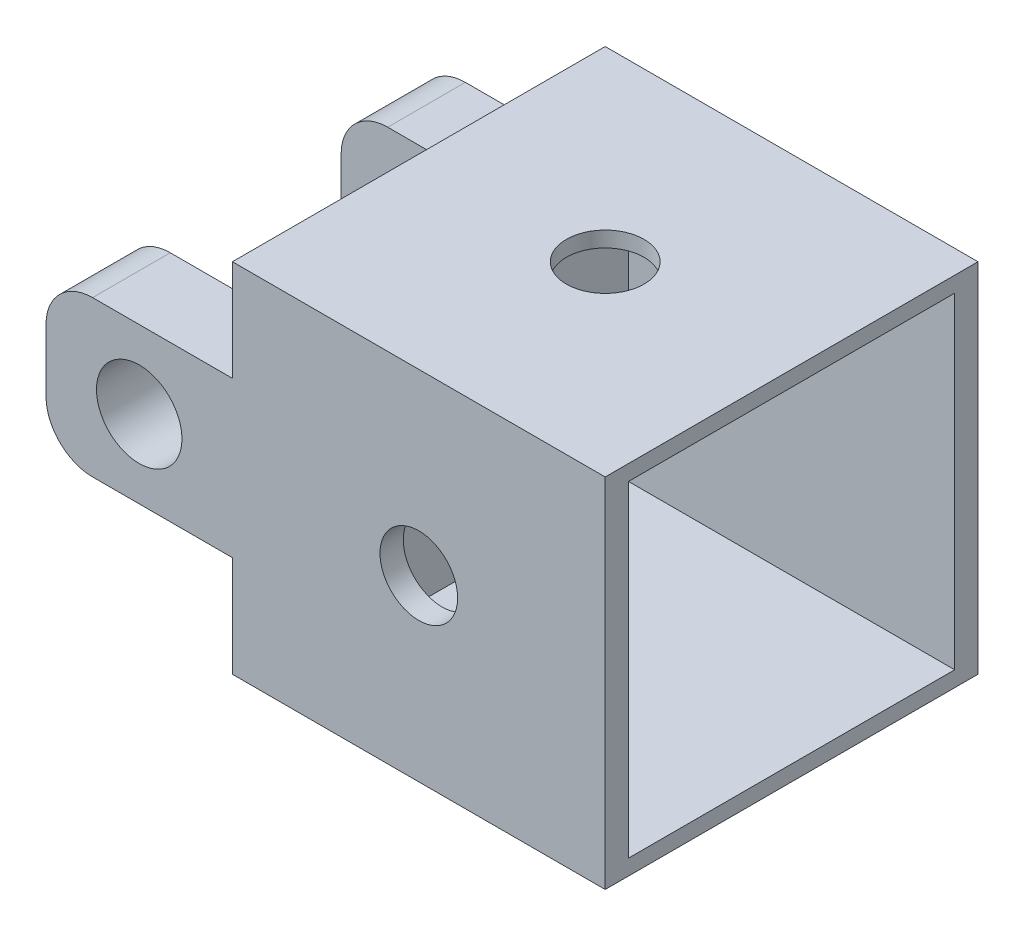
ISO-10303-21;
HEADER;
FILE_DESCRIPTION(('STEP AP214'),'2;1');
FILE_NAME('part.step','',(''),(''),'','','');
FILE_SCHEMA(('AUTOMOTIVE_DESIGN { 1 0 10303 214 1 1 1 1 }'));
ENDSEC;
DATA;
#1=APPLICATION_CONTEXT('core data for automotive mechanical design processes');
#2=APPLICATION_PROTOCOL_DEFINITION('international standard','automotive_design',2000,#1);
#3=PRODUCT_CONTEXT('',#1,'mechanical');
#4=PRODUCT('Part','Part','',(#3));
#5=PRODUCT_RELATED_PRODUCT_CATEGORY('part','',(#4));
#6=PRODUCT_DEFINITION_FORMATION('','',#4);
#7=PRODUCT_DEFINITION_CONTEXT('part definition',#1,'design');
#8=PRODUCT_DEFINITION('design','',#6,#7);
#9=PRODUCT_DEFINITION_SHAPE('','',#8);
#10=(LENGTH_UNIT() NAMED_UNIT(*) SI_UNIT(.MILLI.,.METRE.));
#11=(NAMED_UNIT(*) PLANE_ANGLE_UNIT() SI_UNIT($,.RADIAN.));
#12=(NAMED_UNIT(*) SI_UNIT($,.STERADIAN.) SOLID_ANGLE_UNIT());
#13=UNCERTAINTY_MEASURE_WITH_UNIT(LENGTH_MEASURE(1.E-05),#10,'distance_accuracy_value','');
#14=(GEOMETRIC_REPRESENTATION_CONTEXT(3) GLOBAL_UNCERTAINTY_ASSIGNED_CONTEXT((#13)) GLOBAL_UNIT_ASSIGNED_CONTEXT((#10,
#11,#12)) REPRESENTATION_CONTEXT('',''));
#15=CARTESIAN_POINT('',(0.,0.,0.));
#16=DIRECTION('',(0.,0.,1.));
#17=DIRECTION('',(1.,0.,0.));
#18=AXIS2_PLACEMENT_3D('',#15,#16,#17);
#19=CARTESIAN_POINT('',(-12.,11.5,12.));
#20=DIRECTION('',(1.,0.,0.));
#21=DIRECTION('',(0.,0.,-1.));
#22=AXIS2_PLACEMENT_3D('',#19,#20,#21);
#23=PLANE('',#22);
#24=DIRECTION('',(0.,-1.,0.));
#25=VECTOR('',#24,1.);
#26=CARTESIAN_POINT('',(-12.,11.5,12.));
#27=LINE('',#26,#25);
#28=CARTESIAN_POINT('',(-12.,-5.,12.));
#29=VERTEX_POINT('',#28);
#30=CARTESIAN_POINT('',(-12.,-11.5,12.));
#31=VERTEX_POINT('',#30);
#32=EDGE_CURVE('E211',#29,#31,#27,.T.);
#33=ORIENTED_EDGE('',*,*,#32,.F.);
#34=DIRECTION('',(0.,0.,-1.));
#35=VECTOR('',#34,1.);
#36=CARTESIAN_POINT('',(-12.,-5.,12.));
#37=LINE('',#36,#35);
#38=CARTESIAN_POINT('',(-12.,-5.,7.));
#39=VERTEX_POINT('',#38);
#40=EDGE_CURVE('E189',#29,#39,#37,.T.);
#41=ORIENTED_EDGE('',*,*,#40,.T.);
#42=DIRECTION('',(0.,1.,0.));
#43=VECTOR('',#42,1.);
#44=CARTESIAN_POINT('',(-12.,0.,7.));
#45=LINE('',#44,#43);
#46=CARTESIAN_POINT('',(-12.,5.,7.));
#47=VERTEX_POINT('',#46);
#48=EDGE_CURVE('E199',#39,#47,#45,.T.);
#49=ORIENTED_EDGE('',*,*,#48,.T.);
#50=DIRECTION('',(0.,0.,1.));
#51=VECTOR('',#50,1.);
#52=CARTESIAN_POINT('',(-12.,5.,7.));
#53=LINE('',#52,#51);
#54=CARTESIAN_POINT('',(-12.,5.,12.));
#55=VERTEX_POINT('',#54);
#56=EDGE_CURVE('E208',#47,#55,#53,.T.);
#57=ORIENTED_EDGE('',*,*,#56,.T.);
#58=CARTESIAN_POINT('',(-12.,11.5,12.));
#59=VERTEX_POINT('',#58);
#60=EDGE_CURVE('E356',#59,#55,#27,.T.);
#61=ORIENTED_EDGE('',*,*,#60,.F.);
#62=DIRECTION('',(0.,0.,1.));
#63=VECTOR('',#62,1.);
#64=CARTESIAN_POINT('',(-12.,11.5,12.));
#65=LINE('',#64,#63);
#66=CARTESIAN_POINT('',(-12.,11.5,-12.));
#67=VERTEX_POINT('',#66);
#68=EDGE_CURVE('E334',#67,#59,#65,.T.);
#69=ORIENTED_EDGE('',*,*,#68,.F.);
#70=DIRECTION('',(0.,-1.,0.));
#71=VECTOR('',#70,1.);
#72=CARTESIAN_POINT('',(-12.,11.5,-12.));
#73=LINE('',#72,#71);
#74=CARTESIAN_POINT('',(-12.,5.,-12.));
#75=VERTEX_POINT('',#74);
#76=EDGE_CURVE('E361',#67,#75,#73,.T.);
#77=ORIENTED_EDGE('',*,*,#76,.T.);
#78=DIRECTION('',(0.,0.,-1.));
#79=VECTOR('',#78,1.);
#80=CARTESIAN_POINT('',(-12.,5.,-7.));
#81=LINE('',#80,#79);
#82=CARTESIAN_POINT('',(-12.,5.,-7.));
#83=VERTEX_POINT('',#82);
#84=EDGE_CURVE('E253',#83,#75,#81,.T.);
#85=ORIENTED_EDGE('',*,*,#84,.F.);
#86=DIRECTION('',(0.,1.,0.));
#87=VECTOR('',#86,1.);
#88=CARTESIAN_POINT('',(-12.,0.,-7.));
#89=LINE('',#88,#87);
#90=CARTESIAN_POINT('',(-12.,-5.,-7.));
#91=VERTEX_POINT('',#90);
#92=EDGE_CURVE('E236',#91,#83,#89,.T.);
#93=ORIENTED_EDGE('',*,*,#92,.F.);
#94=DIRECTION('',(0.,0.,1.));
#95=VECTOR('',#94,1.);
#96=CARTESIAN_POINT('',(-12.,-5.,-12.));
#97=LINE('',#96,#95);
#98=CARTESIAN_POINT('',(-12.,-5.,-12.));
#99=VERTEX_POINT('',#98);
#100=EDGE_CURVE('E245',#99,#91,#97,.T.);
#101=ORIENTED_EDGE('',*,*,#100,.F.);
#102=CARTESIAN_POINT('',(-12.,-11.5,-12.));
#103=VERTEX_POINT('',#102);
#104=EDGE_CURVE('E360',#99,#103,#73,.T.);
#105=ORIENTED_EDGE('',*,*,#104,.T.);
#106=DIRECTION('',(0.,0.,1.));
#107=VECTOR('',#106,1.);
#108=CARTESIAN_POINT('',(-12.,-11.5,12.));
#109=LINE('',#108,#107);
#110=EDGE_CURVE('E348',#103,#31,#109,.T.);
#111=ORIENTED_EDGE('',*,*,#110,.T.);
#112=EDGE_LOOP('',(#33,#41,#49,#57,#61,#69,#77,#85,#93,#101,#105,#111));
#113=FACE_BOUND('',#112,.T.);
#114=ADVANCED_FACE('F43',(#113),#23,.F.);
#115=CARTESIAN_POINT('',(12.,11.5,12.));
#116=DIRECTION('',(-1.,0.,0.));
#117=DIRECTION('',(0.,0.,1.));
#118=AXIS2_PLACEMENT_3D('',#115,#116,#117);
#119=PLANE('',#118);
#120=DIRECTION('',(0.,0.,1.));
#121=VECTOR('',#120,1.);
#122=CARTESIAN_POINT('',(12.,10.5,10.5));
#123=LINE('',#122,#121);
#124=CARTESIAN_POINT('',(12.,10.5,-10.5));
#125=VERTEX_POINT('',#124);
#126=CARTESIAN_POINT('',(12.,10.5,10.5));
#127=VERTEX_POINT('',#126);
#128=EDGE_CURVE('E302',#125,#127,#123,.T.);
#129=ORIENTED_EDGE('',*,*,#128,.F.);
#130=DIRECTION('',(0.,1.,0.));
#131=VECTOR('',#130,1.);
#132=CARTESIAN_POINT('',(12.,-10.5,-10.5));
#133=LINE('',#132,#131);
#134=CARTESIAN_POINT('',(12.,-10.5,-10.5));
#135=VERTEX_POINT('',#134);
#136=EDGE_CURVE('E299',#135,#125,#133,.T.);
#137=ORIENTED_EDGE('',*,*,#136,.F.);
#138=DIRECTION('',(0.,0.,-1.));
#139=VECTOR('',#138,1.);
#140=CARTESIAN_POINT('',(12.,-10.5,10.5));
#141=LINE('',#140,#139);
#142=CARTESIAN_POINT('',(12.,-10.5,10.5));
#143=VERTEX_POINT('',#142);
#144=EDGE_CURVE('E286',#143,#135,#141,.T.);
#145=ORIENTED_EDGE('',*,*,#144,.F.);
#146=DIRECTION('',(0.,-1.,0.));
#147=VECTOR('',#146,1.);
#148=CARTESIAN_POINT('',(12.,-10.5,10.5));
#149=LINE('',#148,#147);
#150=EDGE_CURVE('E306',#127,#143,#149,.T.);
#151=ORIENTED_EDGE('',*,*,#150,.F.);
#152=EDGE_LOOP('',(#129,#137,#145,#151));
#153=FACE_BOUND('',#152,.T.);
#154=DIRECTION('',(0.,0.,-1.));
#155=VECTOR('',#154,1.);
#156=CARTESIAN_POINT('',(12.,-11.5,12.));
#157=LINE('',#156,#155);
#158=CARTESIAN_POINT('',(12.,-11.5,12.));
#159=VERTEX_POINT('',#158);
#160=CARTESIAN_POINT('',(12.,-11.5,-12.));
#161=VERTEX_POINT('',#160);
#162=EDGE_CURVE('E316',#159,#161,#157,.T.);
#163=ORIENTED_EDGE('',*,*,#162,.T.);
#164=DIRECTION('',(0.,-1.,0.));
#165=VECTOR('',#164,1.);
#166=CARTESIAN_POINT('',(12.,11.5,-12.));
#167=LINE('',#166,#165);
#168=CARTESIAN_POINT('',(12.,11.5,-12.));
#169=VERTEX_POINT('',#168);
#170=EDGE_CURVE('E365',#169,#161,#167,.T.);
#171=ORIENTED_EDGE('',*,*,#170,.F.);
#172=DIRECTION('',(0.,0.,-1.));
#173=VECTOR('',#172,1.);
#174=CARTESIAN_POINT('',(12.,11.5,12.));
#175=LINE('',#174,#173);
#176=CARTESIAN_POINT('',(12.,11.5,12.));
#177=VERTEX_POINT('',#176);
#178=EDGE_CURVE('E326',#177,#169,#175,.T.);
#179=ORIENTED_EDGE('',*,*,#178,.F.);
#180=DIRECTION('',(0.,-1.,0.));
#181=VECTOR('',#180,1.);
#182=CARTESIAN_POINT('',(12.,11.5,12.));
#183=LINE('',#182,#181);
#184=EDGE_CURVE('E340',#177,#159,#183,.T.);
#185=ORIENTED_EDGE('',*,*,#184,.T.);
#186=EDGE_LOOP('',(#163,#171,#179,#185));
#187=FACE_BOUND('',#186,.T.);
#188=ADVANCED_FACE('F443',(#153,#187),#119,.F.);
#189=CARTESIAN_POINT('',(-12.,11.5,-12.));
#190=DIRECTION('',(0.,0.,1.));
#191=DIRECTION('',(1.,0.,0.));
#192=AXIS2_PLACEMENT_3D('',#189,#190,#191);
#193=PLANE('',#192);
#194=CARTESIAN_POINT('',(-18.,0.,-12.));
#195=DIRECTION('',(0.,0.,-1.));
#196=DIRECTION('',(-1.,0.,0.));
#197=AXIS2_PLACEMENT_3D('',#194,#195,#196);
#198=CIRCLE('',#197,2.75);
#199=CARTESIAN_POINT('',(-20.75,0.,-12.));
#200=VERTEX_POINT('',#199);
#201=EDGE_CURVE('E195',#200,#200,#198,.T.);
#202=ORIENTED_EDGE('',*,*,#201,.F.);
#203=EDGE_LOOP('',(#202));
#204=FACE_BOUND('',#203,.T.);
#205=DIRECTION('',(1.,0.,0.));
#206=VECTOR('',#205,1.);
#207=CARTESIAN_POINT('',(-24.,-5.,-12.));
#208=LINE('',#207,#206);
#209=CARTESIAN_POINT('',(-21.,-5.,-12.));
#210=VERTEX_POINT('',#209);
#211=EDGE_CURVE('E262',#210,#99,#208,.T.);
#212=ORIENTED_EDGE('',*,*,#211,.F.);
#213=CARTESIAN_POINT('',(-21.,-2.,-12.));
#214=DIRECTION('',(0.,0.,1.));
#215=DIRECTION('',(1.,0.,0.));
#216=AXIS2_PLACEMENT_3D('',#213,#214,#215);
#217=CIRCLE('',#216,3.);
#218=CARTESIAN_POINT('',(-24.,-2.,-12.));
#219=VERTEX_POINT('',#218);
#220=EDGE_CURVE('E395',#210,#219,#217,.F.);
#221=ORIENTED_EDGE('',*,*,#220,.T.);
#222=DIRECTION('',(0.,-1.,0.));
#223=VECTOR('',#222,1.);
#224=CARTESIAN_POINT('',(-24.,5.,-12.));
#225=LINE('',#224,#223);
#226=CARTESIAN_POINT('',(-24.,2.,-12.));
#227=VERTEX_POINT('',#226);
#228=EDGE_CURVE('E244',#227,#219,#225,.T.);
#229=ORIENTED_EDGE('',*,*,#228,.F.);
#230=CARTESIAN_POINT('',(-21.,2.,-12.));
#231=DIRECTION('',(0.,0.,1.));
#232=DIRECTION('',(1.,0.,0.));
#233=AXIS2_PLACEMENT_3D('',#230,#231,#232);
#234=CIRCLE('',#233,3.);
#235=CARTESIAN_POINT('',(-21.,5.,-12.));
#236=VERTEX_POINT('',#235);
#237=EDGE_CURVE('E392',#227,#236,#234,.F.);
#238=ORIENTED_EDGE('',*,*,#237,.T.);
#239=DIRECTION('',(1.,0.,0.));
#240=VECTOR('',#239,1.);
#241=CARTESIAN_POINT('',(-24.,5.,-12.));
#242=LINE('',#241,#240);
#243=EDGE_CURVE('E265',#236,#75,#242,.T.);
#244=ORIENTED_EDGE('',*,*,#243,.T.);
#245=ORIENTED_EDGE('',*,*,#76,.F.);
#246=DIRECTION('',(-1.,0.,0.));
#247=VECTOR('',#246,1.);
#248=CARTESIAN_POINT('',(-12.,11.5,-12.));
#249=LINE('',#248,#247);
#250=EDGE_CURVE('E330',#169,#67,#249,.T.);
#251=ORIENTED_EDGE('',*,*,#250,.F.);
#252=ORIENTED_EDGE('',*,*,#170,.T.);
#253=DIRECTION('',(-1.,0.,0.));
#254=VECTOR('',#253,1.);
#255=CARTESIAN_POINT('',(-12.,-11.5,-12.));
#256=LINE('',#255,#254);
#257=EDGE_CURVE('E344',#161,#103,#256,.T.);
#258=ORIENTED_EDGE('',*,*,#257,.T.);
#259=ORIENTED_EDGE('',*,*,#104,.F.);
#260=EDGE_LOOP('',(#212,#221,#229,#238,#244,#245,#251,#252,#258,#259));
#261=FACE_BOUND('',#260,.T.);
#262=ADVANCED_FACE('F448',(#204,#261),#193,.F.);
#263=CARTESIAN_POINT('',(-12.,11.5,12.));
#264=DIRECTION('',(0.,0.,-1.));
#265=DIRECTION('',(-1.,0.,0.));
#266=AXIS2_PLACEMENT_3D('',#263,#264,#265);
#267=PLANE('',#266);
#268=CARTESIAN_POINT('',(-18.,0.,12.));
#269=DIRECTION('',(0.,0.,-1.));
#270=DIRECTION('',(-1.,0.,0.));
#271=AXIS2_PLACEMENT_3D('',#268,#269,#270);
#272=CIRCLE('',#271,2.75);
#273=CARTESIAN_POINT('',(-20.75,0.,12.));
#274=VERTEX_POINT('',#273);
#275=EDGE_CURVE('E219',#274,#274,#272,.T.);
#276=ORIENTED_EDGE('',*,*,#275,.T.);
#277=EDGE_LOOP('',(#276));
#278=FACE_BOUND('',#277,.T.);
#279=CARTESIAN_POINT('',(0.,0.,12.));
#280=DIRECTION('',(0.,0.,1.));
#281=DIRECTION('',(1.,0.,0.));
#282=AXIS2_PLACEMENT_3D('',#279,#280,#281);
#283=CIRCLE('',#282,2.5);
#284=CARTESIAN_POINT('',(2.5,0.,12.));
#285=VERTEX_POINT('',#284);
#286=EDGE_CURVE('E271',#285,#285,#283,.T.);
#287=ORIENTED_EDGE('',*,*,#286,.F.);
#288=EDGE_LOOP('',(#287));
#289=FACE_BOUND('',#288,.T.);
#290=DIRECTION('',(0.,-1.,0.));
#291=VECTOR('',#290,1.);
#292=CARTESIAN_POINT('',(-24.,0.,12.));
#293=LINE('',#292,#291);
#294=CARTESIAN_POINT('',(-24.,2.,12.));
#295=VERTEX_POINT('',#294);
#296=CARTESIAN_POINT('',(-24.,-2.,12.));
#297=VERTEX_POINT('',#296);
#298=EDGE_CURVE('E222',#295,#297,#293,.T.);
#299=ORIENTED_EDGE('',*,*,#298,.T.);
#300=CARTESIAN_POINT('',(-21.,-2.,12.));
#301=DIRECTION('',(0.,0.,-1.));
#302=DIRECTION('',(-1.,0.,0.));
#303=AXIS2_PLACEMENT_3D('',#300,#301,#302);
#304=CIRCLE('',#303,3.);
#305=CARTESIAN_POINT('',(-21.,-5.,12.));
#306=VERTEX_POINT('',#305);
#307=EDGE_CURVE('E52',#297,#306,#304,.F.);
#308=ORIENTED_EDGE('',*,*,#307,.T.);
#309=DIRECTION('',(1.,0.,0.));
#310=VECTOR('',#309,1.);
#311=CARTESIAN_POINT('',(-24.,-5.,12.));
#312=LINE('',#311,#310);
#313=EDGE_CURVE('E196',#306,#29,#312,.T.);
#314=ORIENTED_EDGE('',*,*,#313,.T.);
#315=ORIENTED_EDGE('',*,*,#32,.T.);
#316=DIRECTION('',(1.,0.,0.));
#317=VECTOR('',#316,1.);
#318=CARTESIAN_POINT('',(-12.,-11.5,12.));
#319=LINE('',#318,#317);
#320=EDGE_CURVE('E331',#31,#159,#319,.T.);
#321=ORIENTED_EDGE('',*,*,#320,.T.);
#322=ORIENTED_EDGE('',*,*,#184,.F.);
#323=DIRECTION('',(1.,0.,0.));
#324=VECTOR('',#323,1.);
#325=CARTESIAN_POINT('',(-12.,11.5,12.));
#326=LINE('',#325,#324);
#327=EDGE_CURVE('E337',#59,#177,#326,.T.);
#328=ORIENTED_EDGE('',*,*,#327,.F.);
#329=ORIENTED_EDGE('',*,*,#60,.T.);
#330=DIRECTION('',(1.,0.,0.));
#331=VECTOR('',#330,1.);
#332=CARTESIAN_POINT('',(-24.,5.,12.));
#333=LINE('',#332,#331);
#334=CARTESIAN_POINT('',(-21.,5.,12.));
#335=VERTEX_POINT('',#334);
#336=EDGE_CURVE('E227',#335,#55,#333,.T.);
#337=ORIENTED_EDGE('',*,*,#336,.F.);
#338=CARTESIAN_POINT('',(-21.,2.,12.));
#339=DIRECTION('',(0.,0.,-1.));
#340=DIRECTION('',(-1.,0.,0.));
#341=AXIS2_PLACEMENT_3D('',#338,#339,#340);
#342=CIRCLE('',#341,3.);
#343=EDGE_CURVE('E59',#335,#295,#342,.F.);
#344=ORIENTED_EDGE('',*,*,#343,.T.);
#345=EDGE_LOOP('',(#299,#308,#314,#315,#321,#322,#328,#329,#337,#344));
#346=FACE_BOUND('',#345,.T.);
#347=ADVANCED_FACE('F418',(#278,#289,#346),#267,.F.);
#348=CARTESIAN_POINT('',(0.,11.5,0.));
#349=DIRECTION('',(0.,-1.,0.));
#350=DIRECTION('',(0.,0.,-1.));
#351=AXIS2_PLACEMENT_3D('',#348,#349,#350);
#352=PLANE('',#351);
#353=CARTESIAN_POINT('',(0.,11.5,0.));
#354=DIRECTION('',(0.,1.,0.));
#355=DIRECTION('',(0.,0.,1.));
#356=AXIS2_PLACEMENT_3D('',#353,#354,#355);
#357=CIRCLE('',#356,2.5);
#358=CARTESIAN_POINT('',(0.,11.5,2.5));
#359=VERTEX_POINT('',#358);
#360=EDGE_CURVE('E276',#359,#359,#357,.T.);
#361=ORIENTED_EDGE('',*,*,#360,.F.);
#362=EDGE_LOOP('',(#361));
#363=FACE_BOUND('',#362,.T.);
#364=ORIENTED_EDGE('',*,*,#178,.T.);
#365=ORIENTED_EDGE('',*,*,#250,.T.);
#366=ORIENTED_EDGE('',*,*,#68,.T.);
#367=ORIENTED_EDGE('',*,*,#327,.T.);
#368=EDGE_LOOP('',(#364,#365,#366,#367));
#369=FACE_BOUND('',#368,.T.);
#370=ADVANCED_FACE('F507',(#363,#369),#352,.F.);
#371=CARTESIAN_POINT('',(0.,-11.5,0.));
#372=DIRECTION('',(0.,-1.,0.));
#373=DIRECTION('',(0.,0.,-1.));
#374=AXIS2_PLACEMENT_3D('',#371,#372,#373);
#375=PLANE('',#374);
#376=ORIENTED_EDGE('',*,*,#162,.F.);
#377=ORIENTED_EDGE('',*,*,#320,.F.);
#378=ORIENTED_EDGE('',*,*,#110,.F.);
#379=ORIENTED_EDGE('',*,*,#257,.F.);
#380=EDGE_LOOP('',(#376,#377,#378,#379));
#381=FACE_BOUND('',#380,.T.);
#382=ADVANCED_FACE('F499',(#381),#375,.T.);
#383=CARTESIAN_POINT('',(-9.,-10.5,-10.5));
#384=DIRECTION('',(0.,0.,-1.));
#385=DIRECTION('',(-1.,0.,0.));
#386=AXIS2_PLACEMENT_3D('',#383,#384,#385);
#387=PLANE('',#386);
#388=ORIENTED_EDGE('',*,*,#136,.T.);
#389=DIRECTION('',(1.,0.,0.));
#390=VECTOR('',#389,1.);
#391=CARTESIAN_POINT('',(-9.,10.5,-10.5));
#392=LINE('',#391,#390);
#393=CARTESIAN_POINT('',(-9.,10.5,-10.5));
#394=VERTEX_POINT('',#393);
#395=EDGE_CURVE('E298',#394,#125,#392,.T.);
#396=ORIENTED_EDGE('',*,*,#395,.F.);
#397=DIRECTION('',(0.,1.,0.));
#398=VECTOR('',#397,1.);
#399=CARTESIAN_POINT('',(-9.,-10.5,-10.5));
#400=LINE('',#399,#398);
#401=CARTESIAN_POINT('',(-9.,-10.5,-10.5));
#402=VERTEX_POINT('',#401);
#403=EDGE_CURVE('E281',#402,#394,#400,.T.);
#404=ORIENTED_EDGE('',*,*,#403,.F.);
#405=DIRECTION('',(1.,0.,0.));
#406=VECTOR('',#405,1.);
#407=CARTESIAN_POINT('',(-9.,-10.5,-10.5));
#408=LINE('',#407,#406);
#409=EDGE_CURVE('E313',#402,#135,#408,.T.);
#410=ORIENTED_EDGE('',*,*,#409,.T.);
#411=EDGE_LOOP('',(#388,#396,#404,#410));
#412=FACE_BOUND('',#411,.T.);
#413=ADVANCED_FACE('F716',(#412),#387,.F.);
#414=CARTESIAN_POINT('',(-9.,-10.5,10.5));
#415=DIRECTION('',(0.,-1.,0.));
#416=DIRECTION('',(0.,0.,-1.));
#417=AXIS2_PLACEMENT_3D('',#414,#415,#416);
#418=PLANE('',#417);
#419=ORIENTED_EDGE('',*,*,#144,.T.);
#420=ORIENTED_EDGE('',*,*,#409,.F.);
#421=DIRECTION('',(0.,0.,-1.));
#422=VECTOR('',#421,1.);
#423=CARTESIAN_POINT('',(-9.,-10.5,10.5));
#424=LINE('',#423,#422);
#425=CARTESIAN_POINT('',(-9.,-10.5,10.5));
#426=VERTEX_POINT('',#425);
#427=EDGE_CURVE('E294',#426,#402,#424,.T.);
#428=ORIENTED_EDGE('',*,*,#427,.F.);
#429=DIRECTION('',(1.,0.,0.));
#430=VECTOR('',#429,1.);
#431=CARTESIAN_POINT('',(-9.,-10.5,10.5));
#432=LINE('',#431,#430);
#433=EDGE_CURVE('E317',#426,#143,#432,.T.);
#434=ORIENTED_EDGE('',*,*,#433,.T.);
#435=EDGE_LOOP('',(#419,#420,#428,#434));
#436=FACE_BOUND('',#435,.T.);
#437=ADVANCED_FACE('F664',(#436),#418,.F.);
#438=CARTESIAN_POINT('',(-9.,-10.5,10.5));
#439=DIRECTION('',(0.,0.,1.));
#440=DIRECTION('',(1.,0.,0.));
#441=AXIS2_PLACEMENT_3D('',#438,#439,#440);
#442=PLANE('',#441);
#443=CARTESIAN_POINT('',(0.,0.,10.5));
#444=DIRECTION('',(0.,0.,1.));
#445=DIRECTION('',(1.,0.,0.));
#446=AXIS2_PLACEMENT_3D('',#443,#444,#445);
#447=CIRCLE('',#446,2.5);
#448=CARTESIAN_POINT('',(2.5,0.,10.5));
#449=VERTEX_POINT('',#448);
#450=EDGE_CURVE('E275',#449,#449,#447,.T.);
#451=ORIENTED_EDGE('',*,*,#450,.T.);
#452=EDGE_LOOP('',(#451));
#453=FACE_BOUND('',#452,.T.);
#454=ORIENTED_EDGE('',*,*,#150,.T.);
#455=ORIENTED_EDGE('',*,*,#433,.F.);
#456=DIRECTION('',(0.,-1.,0.));
#457=VECTOR('',#456,1.);
#458=CARTESIAN_POINT('',(-9.,-10.5,10.5));
#459=LINE('',#458,#457);
#460=CARTESIAN_POINT('',(-9.,10.5,10.5));
#461=VERTEX_POINT('',#460);
#462=EDGE_CURVE('E290',#461,#426,#459,.T.);
#463=ORIENTED_EDGE('',*,*,#462,.F.);
#464=DIRECTION('',(1.,0.,0.));
#465=VECTOR('',#464,1.);
#466=CARTESIAN_POINT('',(-9.,10.5,10.5));
#467=LINE('',#466,#465);
#468=EDGE_CURVE('E320',#461,#127,#467,.T.);
#469=ORIENTED_EDGE('',*,*,#468,.T.);
#470=EDGE_LOOP('',(#454,#455,#463,#469));
#471=FACE_BOUND('',#470,.T.);
#472=ADVANCED_FACE('F658',(#453,#471),#442,.F.);
#473=CARTESIAN_POINT('',(-9.,10.5,10.5));
#474=DIRECTION('',(0.,1.,0.));
#475=DIRECTION('',(0.,0.,1.));
#476=AXIS2_PLACEMENT_3D('',#473,#474,#475);
#477=PLANE('',#476);
#478=CARTESIAN_POINT('',(0.,10.5,0.));
#479=DIRECTION('',(0.,1.,0.));
#480=DIRECTION('',(0.,0.,1.));
#481=AXIS2_PLACEMENT_3D('',#478,#479,#480);
#482=CIRCLE('',#481,2.5);
#483=CARTESIAN_POINT('',(0.,10.5,2.5));
#484=VERTEX_POINT('',#483);
#485=EDGE_CURVE('E280',#484,#484,#482,.T.);
#486=ORIENTED_EDGE('',*,*,#485,.T.);
#487=EDGE_LOOP('',(#486));
#488=FACE_BOUND('',#487,.T.);
#489=ORIENTED_EDGE('',*,*,#128,.T.);
#490=ORIENTED_EDGE('',*,*,#468,.F.);
#491=DIRECTION('',(0.,0.,1.));
#492=VECTOR('',#491,1.);
#493=CARTESIAN_POINT('',(-9.,10.5,10.5));
#494=LINE('',#493,#492);
#495=EDGE_CURVE('E285',#394,#461,#494,.T.);
#496=ORIENTED_EDGE('',*,*,#495,.F.);
#497=ORIENTED_EDGE('',*,*,#395,.T.);
#498=EDGE_LOOP('',(#489,#490,#496,#497));
#499=FACE_BOUND('',#498,.T.);
#500=ADVANCED_FACE('F663',(#488,#499),#477,.F.);
#501=CARTESIAN_POINT('',(-9.,0.,0.));
#502=DIRECTION('',(-1.,0.,0.));
#503=DIRECTION('',(0.,0.,1.));
#504=AXIS2_PLACEMENT_3D('',#501,#502,#503);
#505=PLANE('',#504);
#506=ORIENTED_EDGE('',*,*,#403,.T.);
#507=ORIENTED_EDGE('',*,*,#495,.T.);
#508=ORIENTED_EDGE('',*,*,#462,.T.);
#509=ORIENTED_EDGE('',*,*,#427,.T.);
#510=EDGE_LOOP('',(#506,#507,#508,#509));
#511=FACE_BOUND('',#510,.T.);
#512=ADVANCED_FACE('F677',(#511),#505,.F.);
#513=CARTESIAN_POINT('',(0.,8.5,0.));
#514=DIRECTION('',(0.,1.,0.));
#515=DIRECTION('',(0.,0.,1.));
#516=AXIS2_PLACEMENT_3D('',#513,#514,#515);
#517=CYLINDRICAL_SURFACE('',#516,2.5);
#518=ORIENTED_EDGE('',*,*,#360,.T.);
#519=EDGE_LOOP('',(#518));
#520=FACE_BOUND('',#519,.T.);
#521=ORIENTED_EDGE('',*,*,#485,.F.);
#522=EDGE_LOOP('',(#521));
#523=FACE_BOUND('',#522,.T.);
#524=ADVANCED_FACE('F650',(#520,#523),#517,.F.);
#525=CARTESIAN_POINT('',(0.,0.,9.));
#526=DIRECTION('',(0.,0.,1.));
#527=DIRECTION('',(1.,0.,0.));
#528=AXIS2_PLACEMENT_3D('',#525,#526,#527);
#529=CYLINDRICAL_SURFACE('',#528,2.5);
#530=ORIENTED_EDGE('',*,*,#286,.T.);
#531=EDGE_LOOP('',(#530));
#532=FACE_BOUND('',#531,.T.);
#533=ORIENTED_EDGE('',*,*,#450,.F.);
#534=EDGE_LOOP('',(#533));
#535=FACE_BOUND('',#534,.T.);
#536=ADVANCED_FACE('F624',(#532,#535),#529,.F.);
#537=CARTESIAN_POINT('',(-24.,0.,-7.));
#538=DIRECTION('',(0.,0.,-1.));
#539=DIRECTION('',(0.,1.,0.));
#540=AXIS2_PLACEMENT_3D('',#537,#538,#539);
#541=PLANE('',#540);
#542=CARTESIAN_POINT('',(-18.,0.,-7.));
#543=DIRECTION('',(0.,0.,-1.));
#544=DIRECTION('',(-1.,0.,0.));
#545=AXIS2_PLACEMENT_3D('',#542,#543,#544);
#546=CIRCLE('',#545,2.75);
#547=CARTESIAN_POINT('',(-20.75,0.,-7.));
#548=VERTEX_POINT('',#547);
#549=EDGE_CURVE('E232',#548,#548,#546,.T.);
#550=ORIENTED_EDGE('',*,*,#549,.T.);
#551=EDGE_LOOP('',(#550));
#552=FACE_BOUND('',#551,.T.);
#553=DIRECTION('',(0.,1.,0.));
#554=VECTOR('',#553,1.);
#555=CARTESIAN_POINT('',(-24.,-5.,-7.));
#556=LINE('',#555,#554);
#557=CARTESIAN_POINT('',(-24.,-2.,-7.));
#558=VERTEX_POINT('',#557);
#559=CARTESIAN_POINT('',(-24.,2.,-7.));
#560=VERTEX_POINT('',#559);
#561=EDGE_CURVE('E240',#558,#560,#556,.T.);
#562=ORIENTED_EDGE('',*,*,#561,.F.);
#563=CARTESIAN_POINT('',(-21.,-2.,-7.));
#564=DIRECTION('',(0.,0.,-1.));
#565=DIRECTION('',(0.,1.,0.));
#566=AXIS2_PLACEMENT_3D('',#563,#564,#565);
#567=CIRCLE('',#566,3.);
#568=CARTESIAN_POINT('',(-21.,-5.,-7.));
#569=VERTEX_POINT('',#568);
#570=EDGE_CURVE('E386',#558,#569,#567,.F.);
#571=ORIENTED_EDGE('',*,*,#570,.T.);
#572=DIRECTION('',(1.,0.,0.));
#573=VECTOR('',#572,1.);
#574=CARTESIAN_POINT('',(-24.,-5.,-7.));
#575=LINE('',#574,#573);
#576=EDGE_CURVE('E249',#569,#91,#575,.T.);
#577=ORIENTED_EDGE('',*,*,#576,.T.);
#578=ORIENTED_EDGE('',*,*,#92,.T.);
#579=DIRECTION('',(1.,0.,0.));
#580=VECTOR('',#579,1.);
#581=CARTESIAN_POINT('',(-24.,5.,-7.));
#582=LINE('',#581,#580);
#583=CARTESIAN_POINT('',(-21.,5.,-7.));
#584=VERTEX_POINT('',#583);
#585=EDGE_CURVE('E268',#584,#83,#582,.T.);
#586=ORIENTED_EDGE('',*,*,#585,.F.);
#587=CARTESIAN_POINT('',(-21.,2.,-7.));
#588=DIRECTION('',(0.,0.,-1.));
#589=DIRECTION('',(0.,1.,0.));
#590=AXIS2_PLACEMENT_3D('',#587,#588,#589);
#591=CIRCLE('',#590,3.);
#592=EDGE_CURVE('E383',#584,#560,#591,.F.);
#593=ORIENTED_EDGE('',*,*,#592,.T.);
#594=EDGE_LOOP('',(#562,#571,#577,#578,#586,#593));
#595=FACE_BOUND('',#594,.T.);
#596=ADVANCED_FACE('F476',(#552,#595),#541,.F.);
#597=CARTESIAN_POINT('',(-24.,5.,-7.));
#598=DIRECTION('',(0.,-1.,0.));
#599=DIRECTION('',(0.,0.,-1.));
#600=AXIS2_PLACEMENT_3D('',#597,#598,#599);
#601=PLANE('',#600);
#602=ORIENTED_EDGE('',*,*,#243,.F.);
#603=DIRECTION('',(0.,0.,-1.));
#604=VECTOR('',#603,1.);
#605=CARTESIAN_POINT('',(-21.,5.,-7.));
#606=LINE('',#605,#604);
#607=EDGE_CURVE('E398',#236,#584,#606,.F.);
#608=ORIENTED_EDGE('',*,*,#607,.T.);
#609=ORIENTED_EDGE('',*,*,#585,.T.);
#610=ORIENTED_EDGE('',*,*,#84,.T.);
#611=EDGE_LOOP('',(#602,#608,#609,#610));
#612=FACE_BOUND('',#611,.T.);
#613=ADVANCED_FACE('F604',(#612),#601,.F.);
#614=CARTESIAN_POINT('',(-24.,-5.,-12.));
#615=DIRECTION('',(0.,1.,0.));
#616=DIRECTION('',(0.,0.,1.));
#617=AXIS2_PLACEMENT_3D('',#614,#615,#616);
#618=PLANE('',#617);
#619=ORIENTED_EDGE('',*,*,#576,.F.);
#620=DIRECTION('',(0.,0.,1.));
#621=VECTOR('',#620,1.);
#622=CARTESIAN_POINT('',(-21.,-5.,-12.));
#623=LINE('',#622,#621);
#624=EDGE_CURVE('E389',#569,#210,#623,.F.);
#625=ORIENTED_EDGE('',*,*,#624,.T.);
#626=ORIENTED_EDGE('',*,*,#211,.T.);
#627=ORIENTED_EDGE('',*,*,#100,.T.);
#628=EDGE_LOOP('',(#619,#625,#626,#627));
#629=FACE_BOUND('',#628,.T.);
#630=ADVANCED_FACE('F486',(#629),#618,.F.);
#631=CARTESIAN_POINT('',(-24.,0.,0.));
#632=DIRECTION('',(-1.,0.,0.));
#633=DIRECTION('',(0.,0.,1.));
#634=AXIS2_PLACEMENT_3D('',#631,#632,#633);
#635=PLANE('',#634);
#636=ORIENTED_EDGE('',*,*,#228,.T.);
#637=DIRECTION('',(0.,0.,1.));
#638=VECTOR('',#637,1.);
#639=CARTESIAN_POINT('',(-24.,-2.,-7.));
#640=LINE('',#639,#638);
#641=EDGE_CURVE('E379',#219,#558,#640,.T.);
#642=ORIENTED_EDGE('',*,*,#641,.T.);
#643=ORIENTED_EDGE('',*,*,#561,.T.);
#644=DIRECTION('',(0.,0.,-1.));
#645=VECTOR('',#644,1.);
#646=CARTESIAN_POINT('',(-24.,2.,-12.));
#647=LINE('',#646,#645);
#648=EDGE_CURVE('E369',#560,#227,#647,.T.);
#649=ORIENTED_EDGE('',*,*,#648,.T.);
#650=EDGE_LOOP('',(#636,#642,#643,#649));
#651=FACE_BOUND('',#650,.T.);
#652=ADVANCED_FACE('F478',(#651),#635,.T.);
#653=CARTESIAN_POINT('',(-18.,0.,-7.));
#654=DIRECTION('',(0.,0.,-1.));
#655=DIRECTION('',(-1.,0.,0.));
#656=AXIS2_PLACEMENT_3D('',#653,#654,#655);
#657=CYLINDRICAL_SURFACE('',#656,2.75);
#658=ORIENTED_EDGE('',*,*,#549,.F.);
#659=EDGE_LOOP('',(#658));
#660=FACE_BOUND('',#659,.T.);
#661=ORIENTED_EDGE('',*,*,#201,.T.);
#662=EDGE_LOOP('',(#661));
#663=FACE_BOUND('',#662,.T.);
#664=ADVANCED_FACE('F461',(#660,#663),#657,.F.);
#665=CARTESIAN_POINT('',(-21.,-2.,0.));
#666=DIRECTION('',(0.,0.,-1.));
#667=DIRECTION('',(0.,1.,0.));
#668=AXIS2_PLACEMENT_3D('',#665,#666,#667);
#669=CYLINDRICAL_SURFACE('',#668,3.);
#670=ORIENTED_EDGE('',*,*,#220,.F.);
#671=ORIENTED_EDGE('',*,*,#624,.F.);
#672=ORIENTED_EDGE('',*,*,#570,.F.);
#673=ORIENTED_EDGE('',*,*,#641,.F.);
#674=EDGE_LOOP('',(#670,#671,#672,#673));
#675=FACE_BOUND('',#674,.T.);
#676=ADVANCED_FACE('F457',(#675),#669,.T.);
#677=CARTESIAN_POINT('',(-21.,2.,0.));
#678=DIRECTION('',(0.,0.,1.));
#679=DIRECTION('',(0.,-1.,0.));
#680=AXIS2_PLACEMENT_3D('',#677,#678,#679);
#681=CYLINDRICAL_SURFACE('',#680,3.);
#682=ORIENTED_EDGE('',*,*,#592,.F.);
#683=ORIENTED_EDGE('',*,*,#607,.F.);
#684=ORIENTED_EDGE('',*,*,#237,.F.);
#685=ORIENTED_EDGE('',*,*,#648,.F.);
#686=EDGE_LOOP('',(#682,#683,#684,#685));
#687=FACE_BOUND('',#686,.T.);
#688=ADVANCED_FACE('F460',(#687),#681,.T.);
#689=CARTESIAN_POINT('',(-24.,-5.,12.));
#690=DIRECTION('',(0.,-1.,0.));
#691=DIRECTION('',(0.,0.,-1.));
#692=AXIS2_PLACEMENT_3D('',#689,#690,#691);
#693=PLANE('',#692);
#694=ORIENTED_EDGE('',*,*,#313,.F.);
#695=DIRECTION('',(0.,0.,-1.));
#696=VECTOR('',#695,1.);
#697=CARTESIAN_POINT('',(-21.,-5.,12.));
#698=LINE('',#697,#696);
#699=CARTESIAN_POINT('',(-21.,-5.,7.));
#700=VERTEX_POINT('',#699);
#701=EDGE_CURVE('E192',#306,#700,#698,.T.);
#702=ORIENTED_EDGE('',*,*,#701,.T.);
#703=DIRECTION('',(1.,0.,0.));
#704=VECTOR('',#703,1.);
#705=CARTESIAN_POINT('',(-24.,-5.,7.));
#706=LINE('',#705,#704);
#707=EDGE_CURVE('E184',#700,#39,#706,.T.);
#708=ORIENTED_EDGE('',*,*,#707,.T.);
#709=ORIENTED_EDGE('',*,*,#40,.F.);
#710=EDGE_LOOP('',(#694,#702,#708,#709));
#711=FACE_BOUND('',#710,.T.);
#712=ADVANCED_FACE('F187',(#711),#693,.T.);
#713=CARTESIAN_POINT('',(-24.,5.,7.));
#714=DIRECTION('',(0.,1.,0.));
#715=DIRECTION('',(0.,0.,1.));
#716=AXIS2_PLACEMENT_3D('',#713,#714,#715);
#717=PLANE('',#716);
#718=DIRECTION('',(1.,0.,0.));
#719=VECTOR('',#718,1.);
#720=CARTESIAN_POINT('',(-24.,5.,7.));
#721=LINE('',#720,#719);
#722=CARTESIAN_POINT('',(-21.,5.,7.));
#723=VERTEX_POINT('',#722);
#724=EDGE_CURVE('E202',#723,#47,#721,.T.);
#725=ORIENTED_EDGE('',*,*,#724,.F.);
#726=DIRECTION('',(0.,0.,1.));
#727=VECTOR('',#726,1.);
#728=CARTESIAN_POINT('',(-21.,5.,7.));
#729=LINE('',#728,#727);
#730=EDGE_CURVE('E11',#723,#335,#729,.T.);
#731=ORIENTED_EDGE('',*,*,#730,.T.);
#732=ORIENTED_EDGE('',*,*,#336,.T.);
#733=ORIENTED_EDGE('',*,*,#56,.F.);
#734=EDGE_LOOP('',(#725,#731,#732,#733));
#735=FACE_BOUND('',#734,.T.);
#736=ADVANCED_FACE('F468',(#735),#717,.T.);
#737=CARTESIAN_POINT('',(-24.,0.,7.));
#738=DIRECTION('',(0.,0.,-1.));
#739=DIRECTION('',(0.,1.,0.));
#740=AXIS2_PLACEMENT_3D('',#737,#738,#739);
#741=PLANE('',#740);
#742=CARTESIAN_POINT('',(-18.,0.,7.));
#743=DIRECTION('',(0.,0.,-1.));
#744=DIRECTION('',(-1.,0.,0.));
#745=AXIS2_PLACEMENT_3D('',#742,#743,#744);
#746=CIRCLE('',#745,2.75);
#747=CARTESIAN_POINT('',(-20.75,0.,7.));
#748=VERTEX_POINT('',#747);
#749=EDGE_CURVE('E213',#748,#748,#746,.T.);
#750=ORIENTED_EDGE('',*,*,#749,.F.);
#751=EDGE_LOOP('',(#750));
#752=FACE_BOUND('',#751,.T.);
#753=ORIENTED_EDGE('',*,*,#707,.F.);
#754=CARTESIAN_POINT('',(-21.,-2.,7.));
#755=DIRECTION('',(0.,0.,-1.));
#756=DIRECTION('',(0.,1.,0.));
#757=AXIS2_PLACEMENT_3D('',#754,#755,#756);
#758=CIRCLE('',#757,3.);
#759=CARTESIAN_POINT('',(-24.,-2.,7.));
#760=VERTEX_POINT('',#759);
#761=EDGE_CURVE('E406',#700,#760,#758,.T.);
#762=ORIENTED_EDGE('',*,*,#761,.T.);
#763=DIRECTION('',(0.,1.,0.));
#764=VECTOR('',#763,1.);
#765=CARTESIAN_POINT('',(-24.,-5.,7.));
#766=LINE('',#765,#764);
#767=CARTESIAN_POINT('',(-24.,2.,7.));
#768=VERTEX_POINT('',#767);
#769=EDGE_CURVE('E207',#760,#768,#766,.T.);
#770=ORIENTED_EDGE('',*,*,#769,.T.);
#771=CARTESIAN_POINT('',(-21.,2.,7.));
#772=DIRECTION('',(0.,0.,-1.));
#773=DIRECTION('',(0.,1.,0.));
#774=AXIS2_PLACEMENT_3D('',#771,#772,#773);
#775=CIRCLE('',#774,3.);
#776=EDGE_CURVE('E403',#768,#723,#775,.T.);
#777=ORIENTED_EDGE('',*,*,#776,.T.);
#778=ORIENTED_EDGE('',*,*,#724,.T.);
#779=ORIENTED_EDGE('',*,*,#48,.F.);
#780=EDGE_LOOP('',(#753,#762,#770,#777,#778,#779));
#781=FACE_BOUND('',#780,.T.);
#782=ADVANCED_FACE('F200',(#752,#781),#741,.T.);
#783=CARTESIAN_POINT('',(-24.,0.,0.));
#784=DIRECTION('',(-1.,0.,0.));
#785=DIRECTION('',(0.,0.,-1.));
#786=AXIS2_PLACEMENT_3D('',#783,#784,#785);
#787=PLANE('',#786);
#788=ORIENTED_EDGE('',*,*,#769,.F.);
#789=DIRECTION('',(0.,0.,-1.));
#790=VECTOR('',#789,1.);
#791=CARTESIAN_POINT('',(-24.,-2.,0.));
#792=LINE('',#791,#790);
#793=EDGE_CURVE('E66',#760,#297,#792,.F.);
#794=ORIENTED_EDGE('',*,*,#793,.T.);
#795=ORIENTED_EDGE('',*,*,#298,.F.);
#796=DIRECTION('',(0.,0.,1.));
#797=VECTOR('',#796,1.);
#798=CARTESIAN_POINT('',(-24.,2.,0.));
#799=LINE('',#798,#797);
#800=EDGE_CURVE('E409',#295,#768,#799,.F.);
#801=ORIENTED_EDGE('',*,*,#800,.T.);
#802=EDGE_LOOP('',(#788,#794,#795,#801));
#803=FACE_BOUND('',#802,.T.);
#804=ADVANCED_FACE('F423',(#803),#787,.T.);
#805=CARTESIAN_POINT('',(-18.,0.,7.));
#806=DIRECTION('',(0.,0.,1.));
#807=DIRECTION('',(1.,0.,0.));
#808=AXIS2_PLACEMENT_3D('',#805,#806,#807);
#809=CYLINDRICAL_SURFACE('',#808,2.75);
#810=ORIENTED_EDGE('',*,*,#749,.T.);
#811=EDGE_LOOP('',(#810));
#812=FACE_BOUND('',#811,.T.);
#813=ORIENTED_EDGE('',*,*,#275,.F.);
#814=EDGE_LOOP('',(#813));
#815=FACE_BOUND('',#814,.T.);
#816=ADVANCED_FACE('F433',(#812,#815),#809,.F.);
#817=CARTESIAN_POINT('',(-21.,-2.,12.));
#818=DIRECTION('',(0.,0.,-1.));
#819=DIRECTION('',(0.,1.,0.));
#820=AXIS2_PLACEMENT_3D('',#817,#818,#819);
#821=CYLINDRICAL_SURFACE('',#820,3.);
#822=ORIENTED_EDGE('',*,*,#307,.F.);
#823=ORIENTED_EDGE('',*,*,#793,.F.);
#824=ORIENTED_EDGE('',*,*,#761,.F.);
#825=ORIENTED_EDGE('',*,*,#701,.F.);
#826=EDGE_LOOP('',(#822,#823,#824,#825));
#827=FACE_BOUND('',#826,.T.);
#828=ADVANCED_FACE('F420',(#827),#821,.T.);
#829=CARTESIAN_POINT('',(-21.,2.,7.));
#830=DIRECTION('',(0.,0.,1.));
#831=DIRECTION('',(0.,-1.,0.));
#832=AXIS2_PLACEMENT_3D('',#829,#830,#831);
#833=CYLINDRICAL_SURFACE('',#832,3.);
#834=ORIENTED_EDGE('',*,*,#776,.F.);
#835=ORIENTED_EDGE('',*,*,#800,.F.);
#836=ORIENTED_EDGE('',*,*,#343,.F.);
#837=ORIENTED_EDGE('',*,*,#730,.F.);
#838=EDGE_LOOP('',(#834,#835,#836,#837));
#839=FACE_BOUND('',#838,.T.);
#840=ADVANCED_FACE('F45',(#839),#833,.T.);
#841=CLOSED_SHELL('',(#114,#188,#262,#347,#370,#382,#413,#437,#472,#500,#512,#524,#536,#596,
#613,#630,#652,#664,#676,#688,#712,#736,#782,#804,#816,#828,#840));
#842=MANIFOLD_SOLID_BREP('B2',#841);
#843=ADVANCED_BREP_SHAPE_REPRESENTATION('',(#18,#842),#14);
#844=SHAPE_DEFINITION_REPRESENTATION(#9,#843);
ENDSEC;
END-ISO-10303-21;
